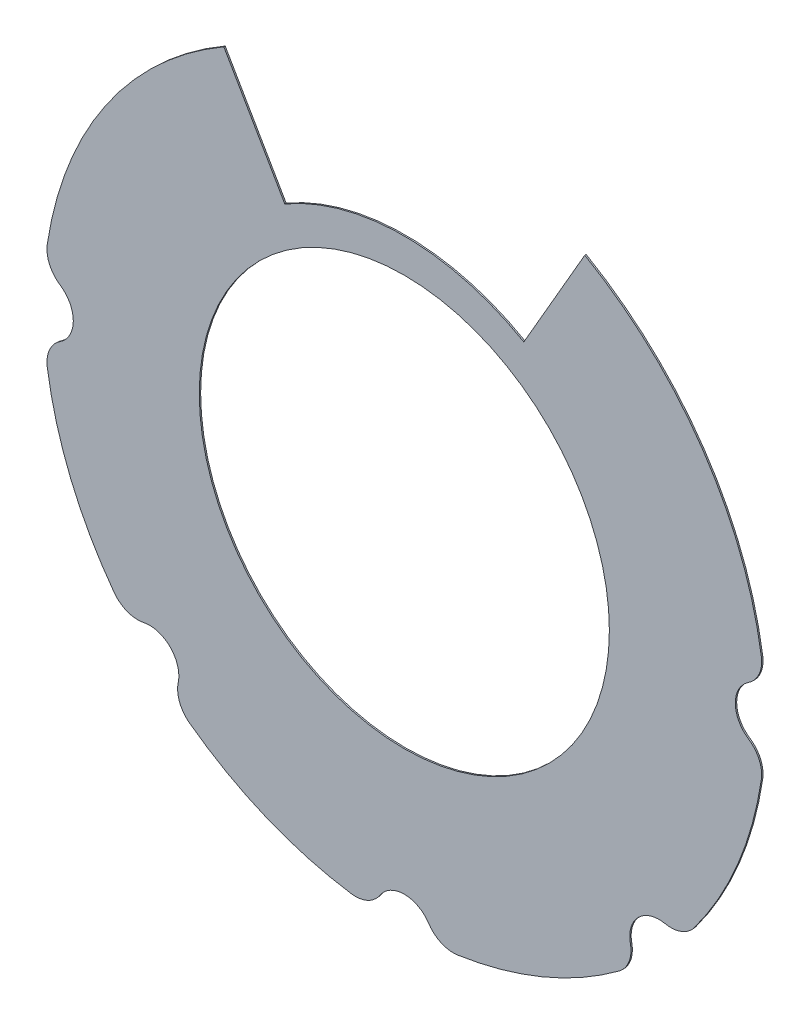
ISO-10303-21;
HEADER;
FILE_DESCRIPTION(('STEP AP214'),'2;1');
FILE_NAME('part.step','',(''),(''),'','','');
FILE_SCHEMA(('AUTOMOTIVE_DESIGN { 1 0 10303 214 1 1 1 1 }'));
ENDSEC;
DATA;
#1=APPLICATION_CONTEXT('core data for automotive mechanical design processes');
#2=APPLICATION_PROTOCOL_DEFINITION('international standard','automotive_design',2000,#1);
#3=PRODUCT_CONTEXT('',#1,'mechanical');
#4=PRODUCT('Part','Part','',(#3));
#5=PRODUCT_RELATED_PRODUCT_CATEGORY('part','',(#4));
#6=PRODUCT_DEFINITION_FORMATION('','',#4);
#7=PRODUCT_DEFINITION_CONTEXT('part definition',#1,'design');
#8=PRODUCT_DEFINITION('design','',#6,#7);
#9=PRODUCT_DEFINITION_SHAPE('','',#8);
#10=(LENGTH_UNIT() NAMED_UNIT(*) SI_UNIT(.MILLI.,.METRE.));
#11=(NAMED_UNIT(*) PLANE_ANGLE_UNIT() SI_UNIT($,.RADIAN.));
#12=(NAMED_UNIT(*) SI_UNIT($,.STERADIAN.) SOLID_ANGLE_UNIT());
#13=UNCERTAINTY_MEASURE_WITH_UNIT(LENGTH_MEASURE(1.E-05),#10,'distance_accuracy_value','');
#14=(GEOMETRIC_REPRESENTATION_CONTEXT(3) GLOBAL_UNCERTAINTY_ASSIGNED_CONTEXT((#13)) GLOBAL_UNIT_ASSIGNED_CONTEXT((#10,
#11,#12)) REPRESENTATION_CONTEXT('',''));
#15=CARTESIAN_POINT('',(0.,0.,0.));
#16=DIRECTION('',(0.,0.,1.));
#17=DIRECTION('',(1.,0.,0.));
#18=AXIS2_PLACEMENT_3D('',#15,#16,#17);
#19=CARTESIAN_POINT('',(-35.5513380281698,5.30522284233726,-15.0100000000009));
#20=DIRECTION('',(0.,0.,1.));
#21=DIRECTION('',(1.,0.,0.));
#22=AXIS2_PLACEMENT_3D('',#19,#20,#21);
#23=CYLINDRICAL_SURFACE('',#22,3.17999999998725);
#24=CARTESIAN_POINT('',(-35.5513380281698,5.30522284233726,-15.0100000000009));
#25=DIRECTION('',(0.,0.,1.));
#26=DIRECTION('',(1.,0.,0.));
#27=AXIS2_PLACEMENT_3D('',#24,#25,#26);
#28=CIRCLE('',#27,3.17999999998725);
#29=CARTESIAN_POINT('',(-38.6965113465558,5.77456791506877,-15.0100000000009));
#30=VERTEX_POINT('',#29);
#31=CARTESIAN_POINT('',(-37.3020453564706,2.65052439418642,-15.0100000000009));
#32=VERTEX_POINT('',#31);
#33=EDGE_CURVE('E20',#30,#32,#28,.T.);
#34=ORIENTED_EDGE('',*,*,#33,.T.);
#35=DIRECTION('',(0.,0.,-1.));
#36=VECTOR('',#35,1.);
#37=CARTESIAN_POINT('',(-37.3020453566199,2.65052439428489,-14.935));
#38=LINE('',#37,#36);
#39=CARTESIAN_POINT('',(-37.3020453564679,2.65052439419047,-14.859999999999));
#40=VERTEX_POINT('',#39);
#41=EDGE_CURVE('E157',#32,#40,#38,.F.);
#42=ORIENTED_EDGE('',*,*,#41,.T.);
#43=CARTESIAN_POINT('',(-35.5513380281698,5.30522284233726,-14.859999999999));
#44=DIRECTION('',(0.,0.,1.));
#45=DIRECTION('',(1.,0.,0.));
#46=AXIS2_PLACEMENT_3D('',#43,#44,#45);
#47=CIRCLE('',#46,3.17999999998725);
#48=CARTESIAN_POINT('',(-38.696511346566,5.77456791507029,-14.859999999999));
#49=VERTEX_POINT('',#48);
#50=EDGE_CURVE('E284',#40,#49,#47,.F.);
#51=ORIENTED_EDGE('',*,*,#50,.T.);
#52=DIRECTION('',(0.,0.,-1.));
#53=VECTOR('',#52,1.);
#54=CARTESIAN_POINT('',(-38.6965113465631,5.77456791509018,-14.935));
#55=LINE('',#54,#53);
#56=EDGE_CURVE('E166',#49,#30,#55,.T.);
#57=ORIENTED_EDGE('',*,*,#56,.T.);
#58=EDGE_LOOP('',(#34,#42,#51,#57));
#59=FACE_BOUND('',#58,.T.);
#60=ADVANCED_FACE('F16',(#59),#23,.T.);
#61=CARTESIAN_POINT('',(0.,0.,-15.0100000000009));
#62=DIRECTION('',(0.,0.,1.));
#63=DIRECTION('',(1.,0.,0.));
#64=AXIS2_PLACEMENT_3D('',#61,#62,#63);
#65=CYLINDRICAL_SURFACE('',#64,39.1250000000086);
#66=DIRECTION('',(0.,0.,1.));
#67=VECTOR('',#66,1.);
#68=CARTESIAN_POINT('',(-19.5624999999948,33.8832439230683,-14.935));
#69=LINE('',#68,#67);
#70=CARTESIAN_POINT('',(-19.5624999999971,33.8832439230723,-14.859999999999));
#71=VERTEX_POINT('',#70);
#72=CARTESIAN_POINT('',(-19.5624999999971,33.8832439230723,-15.0100000000009));
#73=VERTEX_POINT('',#72);
#74=EDGE_CURVE('E214',#71,#73,#69,.F.);
#75=ORIENTED_EDGE('',*,*,#74,.T.);
#76=CARTESIAN_POINT('',(0.,0.,-15.0100000000009));
#77=DIRECTION('',(0.,0.,1.));
#78=DIRECTION('',(1.,0.,0.));
#79=AXIS2_PLACEMENT_3D('',#76,#77,#78);
#80=CIRCLE('',#79,39.1250000000086);
#81=EDGE_CURVE('E289',#73,#30,#80,.T.);
#82=ORIENTED_EDGE('',*,*,#81,.T.);
#83=ORIENTED_EDGE('',*,*,#56,.F.);
#84=CARTESIAN_POINT('',(0.,0.,-14.859999999999));
#85=DIRECTION('',(0.,0.,1.));
#86=DIRECTION('',(1.,0.,0.));
#87=AXIS2_PLACEMENT_3D('',#84,#85,#86);
#88=CIRCLE('',#87,39.1250000000086);
#89=EDGE_CURVE('E281',#49,#71,#88,.F.);
#90=ORIENTED_EDGE('',*,*,#89,.T.);
#91=EDGE_LOOP('',(#75,#82,#83,#90));
#92=FACE_BOUND('',#91,.T.);
#93=ADVANCED_FACE('F489',(#92),#65,.T.);
#94=CARTESIAN_POINT('',(-12.8228499999942,22.2098276978301,-15.0130000000004));
#95=DIRECTION('',(0.866025403784543,0.499999999999819,0.));
#96=DIRECTION('',(-0.499999999999819,0.866025403784543,0.));
#97=AXIS2_PLACEMENT_3D('',#94,#95,#96);
#98=PLANE('',#97);
#99=DIRECTION('',(-0.499999999999819,0.866025403784543,0.));
#100=VECTOR('',#99,1.);
#101=CARTESIAN_POINT('',(-12.8228499999942,22.2098276978301,-14.859999999999));
#102=LINE('',#101,#100);
#103=CARTESIAN_POINT('',(-12.9549999999936,22.4387182120444,-14.859999999999));
#104=VERTEX_POINT('',#103);
#105=EDGE_CURVE('E278',#71,#104,#102,.F.);
#106=ORIENTED_EDGE('',*,*,#105,.T.);
#107=DIRECTION('',(0.,0.,-1.));
#108=VECTOR('',#107,1.);
#109=CARTESIAN_POINT('',(-12.9549999999957,22.4387182120432,-14.935));
#110=LINE('',#109,#108);
#111=CARTESIAN_POINT('',(-12.9549999999936,22.4387182120444,-15.0100000000009));
#112=VERTEX_POINT('',#111);
#113=EDGE_CURVE('E212',#104,#112,#110,.T.);
#114=ORIENTED_EDGE('',*,*,#113,.T.);
#115=DIRECTION('',(-0.499999999999819,0.866025403784543,0.));
#116=VECTOR('',#115,1.);
#117=CARTESIAN_POINT('',(-12.8228499999942,22.2098276978301,-15.0100000000009));
#118=LINE('',#117,#116);
#119=EDGE_CURVE('E291',#112,#73,#118,.T.);
#120=ORIENTED_EDGE('',*,*,#119,.T.);
#121=ORIENTED_EDGE('',*,*,#74,.F.);
#122=EDGE_LOOP('',(#106,#114,#120,#121));
#123=FACE_BOUND('',#122,.T.);
#124=ADVANCED_FACE('F487',(#123),#98,.T.);
#125=CARTESIAN_POINT('',(0.,0.,-14.859999999999));
#126=DIRECTION('',(0.,0.,-1.));
#127=DIRECTION('',(0.,1.,0.));
#128=AXIS2_PLACEMENT_3D('',#125,#126,#127);
#129=CYLINDRICAL_SURFACE('',#128,25.9099999999878);
#130=CARTESIAN_POINT('',(0.,0.,-14.859999999999));
#131=DIRECTION('',(0.,0.,-1.));
#132=DIRECTION('',(0.,1.,0.));
#133=AXIS2_PLACEMENT_3D('',#130,#131,#132);
#134=CIRCLE('',#133,25.9099999999878);
#135=CARTESIAN_POINT('',(12.954999999992,22.4387182120467,-14.859999999999));
#136=VERTEX_POINT('',#135);
#137=EDGE_CURVE('E275',#104,#136,#134,.T.);
#138=ORIENTED_EDGE('',*,*,#137,.T.);
#139=DIRECTION('',(0.,0.,-1.));
#140=VECTOR('',#139,1.);
#141=CARTESIAN_POINT('',(12.9549999999927,22.4387182120478,-14.935));
#142=LINE('',#141,#140);
#143=CARTESIAN_POINT('',(12.954999999992,22.4387182120467,-15.0100000000009));
#144=VERTEX_POINT('',#143);
#145=EDGE_CURVE('E210',#136,#144,#142,.T.);
#146=ORIENTED_EDGE('',*,*,#145,.T.);
#147=CARTESIAN_POINT('',(0.,0.,-15.0100000000009));
#148=DIRECTION('',(0.,0.,-1.));
#149=DIRECTION('',(0.,1.,0.));
#150=AXIS2_PLACEMENT_3D('',#147,#148,#149);
#151=CIRCLE('',#150,25.9099999999878);
#152=EDGE_CURVE('E294',#144,#112,#151,.F.);
#153=ORIENTED_EDGE('',*,*,#152,.T.);
#154=ORIENTED_EDGE('',*,*,#113,.F.);
#155=EDGE_LOOP('',(#138,#146,#153,#154));
#156=FACE_BOUND('',#155,.T.);
#157=ADVANCED_FACE('F484',(#156),#129,.T.);
#158=CARTESIAN_POINT('',(19.6946499999938,34.1121344372914,-14.8569999999995));
#159=DIRECTION('',(0.866025403784623,-0.49999999999968,0.));
#160=DIRECTION('',(-0.49999999999968,-0.866025403784623,0.));
#161=AXIS2_PLACEMENT_3D('',#158,#159,#160);
#162=PLANE('',#161);
#163=DIRECTION('',(-0.49999999999968,-0.866025403784623,0.));
#164=VECTOR('',#163,1.);
#165=CARTESIAN_POINT('',(19.6946499999938,34.1121344372914,-14.859999999999));
#166=LINE('',#165,#164);
#167=CARTESIAN_POINT('',(19.562500000002,33.8832439230749,-14.859999999999));
#168=VERTEX_POINT('',#167);
#169=EDGE_CURVE('E272',#136,#168,#166,.F.);
#170=ORIENTED_EDGE('',*,*,#169,.T.);
#171=DIRECTION('',(0.,0.,-1.));
#172=VECTOR('',#171,1.);
#173=CARTESIAN_POINT('',(19.5625000000065,33.8832439230724,-14.935));
#174=LINE('',#173,#172);
#175=CARTESIAN_POINT('',(19.562500000002,33.8832439230749,-15.0100000000009));
#176=VERTEX_POINT('',#175);
#177=EDGE_CURVE('E208',#168,#176,#174,.T.);
#178=ORIENTED_EDGE('',*,*,#177,.T.);
#179=DIRECTION('',(-0.49999999999968,-0.866025403784623,0.));
#180=VECTOR('',#179,1.);
#181=CARTESIAN_POINT('',(19.6946499999938,34.1121344372914,-15.0100000000009));
#182=LINE('',#181,#180);
#183=EDGE_CURVE('E297',#176,#144,#182,.T.);
#184=ORIENTED_EDGE('',*,*,#183,.T.);
#185=ORIENTED_EDGE('',*,*,#145,.F.);
#186=EDGE_LOOP('',(#170,#178,#184,#185));
#187=FACE_BOUND('',#186,.T.);
#188=ADVANCED_FACE('F482',(#187),#162,.F.);
#189=CARTESIAN_POINT('',(0.,0.,-15.0100000000009));
#190=DIRECTION('',(0.,0.,1.));
#191=DIRECTION('',(1.,0.,0.));
#192=AXIS2_PLACEMENT_3D('',#189,#190,#191);
#193=CYLINDRICAL_SURFACE('',#192,39.1250000000086);
#194=ORIENTED_EDGE('',*,*,#177,.F.);
#195=CARTESIAN_POINT('',(0.,0.,-14.859999999999));
#196=DIRECTION('',(0.,0.,1.));
#197=DIRECTION('',(1.,0.,0.));
#198=AXIS2_PLACEMENT_3D('',#195,#196,#197);
#199=CIRCLE('',#198,39.1250000000086);
#200=CARTESIAN_POINT('',(38.6965113465484,5.77456791504861,-14.859999999999));
#201=VERTEX_POINT('',#200);
#202=EDGE_CURVE('E269',#168,#201,#199,.F.);
#203=ORIENTED_EDGE('',*,*,#202,.T.);
#204=DIRECTION('',(0.,0.,-1.));
#205=VECTOR('',#204,1.);
#206=CARTESIAN_POINT('',(38.6965113465482,5.77456791504986,-14.935));
#207=LINE('',#206,#205);
#208=CARTESIAN_POINT('',(38.6965113465586,5.77456791505013,-15.0100000000009));
#209=VERTEX_POINT('',#208);
#210=EDGE_CURVE('E206',#201,#209,#207,.T.);
#211=ORIENTED_EDGE('',*,*,#210,.T.);
#212=CARTESIAN_POINT('',(0.,0.,-15.0100000000009));
#213=DIRECTION('',(0.,0.,1.));
#214=DIRECTION('',(1.,0.,0.));
#215=AXIS2_PLACEMENT_3D('',#212,#213,#214);
#216=CIRCLE('',#215,39.1250000000086);
#217=EDGE_CURVE('E300',#209,#176,#216,.T.);
#218=ORIENTED_EDGE('',*,*,#217,.T.);
#219=EDGE_LOOP('',(#194,#203,#211,#218));
#220=FACE_BOUND('',#219,.T.);
#221=ADVANCED_FACE('F478',(#220),#193,.T.);
#222=CARTESIAN_POINT('',(35.5513380281698,5.30522284233726,-14.859999999999));
#223=DIRECTION('',(0.,0.,-1.));
#224=DIRECTION('',(0.,1.,0.));
#225=AXIS2_PLACEMENT_3D('',#222,#223,#224);
#226=CYLINDRICAL_SURFACE('',#225,3.17999999998725);
#227=CARTESIAN_POINT('',(35.5513380281698,5.30522284233726,-14.859999999999));
#228=DIRECTION('',(0.,0.,-1.));
#229=DIRECTION('',(0.,1.,0.));
#230=AXIS2_PLACEMENT_3D('',#227,#228,#229);
#231=CIRCLE('',#230,3.17999999998725);
#232=CARTESIAN_POINT('',(37.3020453564583,2.65052439417827,-14.859999999999));
#233=VERTEX_POINT('',#232);
#234=EDGE_CURVE('E266',#201,#233,#231,.T.);
#235=ORIENTED_EDGE('',*,*,#234,.T.);
#236=DIRECTION('',(0.,0.,1.));
#237=VECTOR('',#236,1.);
#238=CARTESIAN_POINT('',(37.3020453565952,2.6505243942686,-14.935));
#239=LINE('',#238,#237);
#240=CARTESIAN_POINT('',(37.3020453564556,2.65052439418232,-15.0100000000009));
#241=VERTEX_POINT('',#240);
#242=EDGE_CURVE('E204',#233,#241,#239,.F.);
#243=ORIENTED_EDGE('',*,*,#242,.T.);
#244=CARTESIAN_POINT('',(35.5513380281698,5.30522284233726,-15.0100000000009));
#245=DIRECTION('',(0.,0.,-1.));
#246=DIRECTION('',(0.,1.,0.));
#247=AXIS2_PLACEMENT_3D('',#244,#245,#246);
#248=CIRCLE('',#247,3.17999999998725);
#249=EDGE_CURVE('E303',#241,#209,#248,.F.);
#250=ORIENTED_EDGE('',*,*,#249,.T.);
#251=ORIENTED_EDGE('',*,*,#210,.F.);
#252=EDGE_LOOP('',(#235,#243,#250,#251));
#253=FACE_BOUND('',#252,.T.);
#254=ADVANCED_FACE('F474',(#253),#226,.T.);
#255=CARTESIAN_POINT('',(39.0499999999962,0.,-14.859999999999));
#256=DIRECTION('',(0.,0.,-1.));
#257=DIRECTION('',(0.,1.,0.));
#258=AXIS2_PLACEMENT_3D('',#255,#256,#257);
#259=CYLINDRICAL_SURFACE('',#258,3.175);
#260=CARTESIAN_POINT('',(39.0499999999962,0.,-15.0100000000009));
#261=DIRECTION('',(0.,0.,-1.));
#262=DIRECTION('',(0.,1.,0.));
#263=AXIS2_PLACEMENT_3D('',#260,#261,#262);
#264=CIRCLE('',#263,3.175);
#265=CARTESIAN_POINT('',(37.3020453564532,-2.65052439418078,-15.0100000000009));
#266=VERTEX_POINT('',#265);
#267=EDGE_CURVE('E306',#266,#241,#264,.T.);
#268=ORIENTED_EDGE('',*,*,#267,.T.);
#269=ORIENTED_EDGE('',*,*,#242,.F.);
#270=CARTESIAN_POINT('',(39.0499999999962,0.,-14.859999999999));
#271=DIRECTION('',(0.,0.,-1.));
#272=DIRECTION('',(0.,1.,0.));
#273=AXIS2_PLACEMENT_3D('',#270,#271,#272);
#274=CIRCLE('',#273,3.175);
#275=CARTESIAN_POINT('',(37.3020453564506,-2.65052439418483,-14.859999999999));
#276=VERTEX_POINT('',#275);
#277=EDGE_CURVE('E263',#233,#276,#274,.F.);
#278=ORIENTED_EDGE('',*,*,#277,.T.);
#279=DIRECTION('',(0.,0.,-1.));
#280=VECTOR('',#279,1.);
#281=CARTESIAN_POINT('',(37.3020453565852,-2.65052439427361,-14.935));
#282=LINE('',#281,#280);
#283=EDGE_CURVE('E200',#276,#266,#282,.T.);
#284=ORIENTED_EDGE('',*,*,#283,.T.);
#285=EDGE_LOOP('',(#268,#269,#278,#284));
#286=FACE_BOUND('',#285,.T.);
#287=ADVANCED_FACE('F470',(#286),#259,.F.);
#288=CARTESIAN_POINT('',(35.5513380281698,-5.30522284233726,-15.0100000000009));
#289=DIRECTION('',(0.,0.,1.));
#290=DIRECTION('',(1.,0.,0.));
#291=AXIS2_PLACEMENT_3D('',#288,#289,#290);
#292=CYLINDRICAL_SURFACE('',#291,3.17999999998725);
#293=CARTESIAN_POINT('',(35.5513380281698,-5.30522284233726,-15.0100000000009));
#294=DIRECTION('',(0.,0.,1.));
#295=DIRECTION('',(1.,0.,0.));
#296=AXIS2_PLACEMENT_3D('',#293,#294,#295);
#297=CIRCLE('',#296,3.17999999998725);
#298=CARTESIAN_POINT('',(38.6965113465556,-5.77456791507001,-15.0100000000009));
#299=VERTEX_POINT('',#298);
#300=EDGE_CURVE('E309',#299,#266,#297,.T.);
#301=ORIENTED_EDGE('',*,*,#300,.T.);
#302=ORIENTED_EDGE('',*,*,#283,.F.);
#303=CARTESIAN_POINT('',(35.5513380281698,-5.30522284233726,-14.859999999999));
#304=DIRECTION('',(0.,0.,1.));
#305=DIRECTION('',(1.,0.,0.));
#306=AXIS2_PLACEMENT_3D('',#303,#304,#305);
#307=CIRCLE('',#306,3.17999999998725);
#308=CARTESIAN_POINT('',(38.6965113465658,-5.77456791507154,-14.859999999999));
#309=VERTEX_POINT('',#308);
#310=EDGE_CURVE('E260',#276,#309,#307,.F.);
#311=ORIENTED_EDGE('',*,*,#310,.T.);
#312=DIRECTION('',(0.,0.,-1.));
#313=VECTOR('',#312,1.);
#314=CARTESIAN_POINT('',(38.6965113465627,-5.77456791509266,-14.935));
#315=LINE('',#314,#313);
#316=EDGE_CURVE('E198',#309,#299,#315,.T.);
#317=ORIENTED_EDGE('',*,*,#316,.T.);
#318=EDGE_LOOP('',(#301,#302,#311,#317));
#319=FACE_BOUND('',#318,.T.);
#320=ADVANCED_FACE('F466',(#319),#292,.T.);
#321=CARTESIAN_POINT('',(0.,0.,-15.0100000000009));
#322=DIRECTION('',(0.,0.,1.));
#323=DIRECTION('',(1.,0.,0.));
#324=AXIS2_PLACEMENT_3D('',#321,#322,#323);
#325=CYLINDRICAL_SURFACE('',#324,39.1250000000086);
#326=ORIENTED_EDGE('',*,*,#316,.F.);
#327=CARTESIAN_POINT('',(0.,0.,-14.859999999999));
#328=DIRECTION('',(0.,0.,1.));
#329=DIRECTION('',(1.,0.,0.));
#330=AXIS2_PLACEMENT_3D('',#327,#328,#329);
#331=CIRCLE('',#330,39.1250000000086);
#332=CARTESIAN_POINT('',(31.4458017125821,-23.2793294502578,-14.859999999999));
#333=VERTEX_POINT('',#332);
#334=EDGE_CURVE('E258',#309,#333,#331,.F.);
#335=ORIENTED_EDGE('',*,*,#334,.T.);
#336=DIRECTION('',(0.,0.,1.));
#337=VECTOR('',#336,1.);
#338=CARTESIAN_POINT('',(31.4458017125908,-23.2793294502462,-14.935));
#339=LINE('',#338,#337);
#340=CARTESIAN_POINT('',(31.4458017125821,-23.2793294502578,-15.0100000000009));
#341=VERTEX_POINT('',#340);
#342=EDGE_CURVE('E35',#341,#333,#339,.T.);
#343=ORIENTED_EDGE('',*,*,#342,.F.);
#344=CARTESIAN_POINT('',(0.,0.,-15.0100000000009));
#345=DIRECTION('',(0.,0.,1.));
#346=DIRECTION('',(1.,0.,0.));
#347=AXIS2_PLACEMENT_3D('',#344,#345,#346);
#348=CIRCLE('',#347,39.1250000000086);
#349=EDGE_CURVE('E312',#341,#299,#348,.T.);
#350=ORIENTED_EDGE('',*,*,#349,.T.);
#351=EDGE_LOOP('',(#326,#335,#343,#350));
#352=FACE_BOUND('',#351,.T.);
#353=ADVANCED_FACE('F463',(#352),#325,.T.);
#354=CARTESIAN_POINT('',(27.61251980533,-27.61251980533,-14.859999999999));
#355=DIRECTION('',(0.,0.,-1.));
#356=DIRECTION('',(0.,1.,0.));
#357=AXIS2_PLACEMENT_3D('',#354,#355,#356);
#358=CYLINDRICAL_SURFACE('',#357,3.17499999999215);
#359=CARTESIAN_POINT('',(27.61251980533,-27.61251980533,-15.0100000000009));
#360=DIRECTION('',(0.,0.,-1.));
#361=DIRECTION('',(0.,1.,0.));
#362=AXIS2_PLACEMENT_3D('',#359,#360,#361);
#363=CIRCLE('',#362,3.17499999999215);
#364=CARTESIAN_POINT('',(24.5023254508345,-28.2507329963752,-15.0100000000009));
#365=VERTEX_POINT('',#364);
#366=CARTESIAN_POINT('',(28.2507329963749,-24.502325450836,-15.0100000000009));
#367=VERTEX_POINT('',#366);
#368=EDGE_CURVE('E315',#365,#367,#363,.T.);
#369=ORIENTED_EDGE('',*,*,#368,.T.);
#370=DIRECTION('',(0.,0.,1.));
#371=VECTOR('',#370,1.);
#372=CARTESIAN_POINT('',(28.2507329964124,-24.5023254508437,-14.935));
#373=LINE('',#372,#371);
#374=CARTESIAN_POINT('',(28.2507329963749,-24.502325450836,-14.859999999999));
#375=VERTEX_POINT('',#374);
#376=EDGE_CURVE('E196',#375,#367,#373,.F.);
#377=ORIENTED_EDGE('',*,*,#376,.F.);
#378=CARTESIAN_POINT('',(27.61251980533,-27.61251980533,-14.859999999999));
#379=DIRECTION('',(0.,0.,-1.));
#380=DIRECTION('',(0.,1.,0.));
#381=AXIS2_PLACEMENT_3D('',#378,#379,#380);
#382=CIRCLE('',#381,3.17499999999215);
#383=CARTESIAN_POINT('',(24.502325450833,-28.2507329963755,-14.859999999999));
#384=VERTEX_POINT('',#383);
#385=EDGE_CURVE('E255',#375,#384,#382,.F.);
#386=ORIENTED_EDGE('',*,*,#385,.T.);
#387=DIRECTION('',(0.,0.,-1.));
#388=VECTOR('',#387,1.);
#389=CARTESIAN_POINT('',(24.5023254508407,-28.250732996413,-14.935));
#390=LINE('',#389,#388);
#391=EDGE_CURVE('E193',#384,#365,#390,.T.);
#392=ORIENTED_EDGE('',*,*,#391,.T.);
#393=EDGE_LOOP('',(#369,#377,#386,#392));
#394=FACE_BOUND('',#393,.T.);
#395=ADVANCED_FACE('F422',(#394),#358,.F.);
#396=CARTESIAN_POINT('',(21.3872331524509,-28.8899512474902,-15.0100000000009));
#397=DIRECTION('',(0.,0.,1.));
#398=DIRECTION('',(1.,0.,0.));
#399=AXIS2_PLACEMENT_3D('',#396,#397,#398);
#400=CYLINDRICAL_SURFACE('',#399,3.17999999999959);
#401=CARTESIAN_POINT('',(21.3872331524509,-28.8899512474902,-15.0100000000009));
#402=DIRECTION('',(0.,0.,1.));
#403=DIRECTION('',(1.,0.,0.));
#404=AXIS2_PLACEMENT_3D('',#401,#402,#403);
#405=CIRCLE('',#404,3.17999999999959);
#406=CARTESIAN_POINT('',(23.2793294502537,-31.4458017125766,-15.0100000000009));
#407=VERTEX_POINT('',#406);
#408=EDGE_CURVE('E318',#407,#365,#405,.T.);
#409=ORIENTED_EDGE('',*,*,#408,.T.);
#410=ORIENTED_EDGE('',*,*,#391,.F.);
#411=CARTESIAN_POINT('',(21.3872331524509,-28.8899512474902,-14.859999999999));
#412=DIRECTION('',(0.,0.,1.));
#413=DIRECTION('',(1.,0.,0.));
#414=AXIS2_PLACEMENT_3D('',#411,#412,#413);
#415=CIRCLE('',#414,3.17999999999959);
#416=CARTESIAN_POINT('',(23.2793294502578,-31.4458017125821,-14.859999999999));
#417=VERTEX_POINT('',#416);
#418=EDGE_CURVE('E252',#384,#417,#415,.F.);
#419=ORIENTED_EDGE('',*,*,#418,.T.);
#420=DIRECTION('',(0.,0.,-1.));
#421=VECTOR('',#420,1.);
#422=CARTESIAN_POINT('',(23.2793294502461,-31.4458017125908,-14.935));
#423=LINE('',#422,#421);
#424=EDGE_CURVE('E191',#417,#407,#423,.T.);
#425=ORIENTED_EDGE('',*,*,#424,.T.);
#426=EDGE_LOOP('',(#409,#410,#419,#425));
#427=FACE_BOUND('',#426,.T.);
#428=ADVANCED_FACE('F417',(#427),#400,.T.);
#429=CARTESIAN_POINT('',(0.,0.,-15.0100000000009));
#430=DIRECTION('',(0.,0.,1.));
#431=DIRECTION('',(1.,0.,0.));
#432=AXIS2_PLACEMENT_3D('',#429,#430,#431);
#433=CYLINDRICAL_SURFACE('',#432,39.1250000000086);
#434=ORIENTED_EDGE('',*,*,#424,.F.);
#435=CARTESIAN_POINT('',(0.,0.,-14.859999999999));
#436=DIRECTION('',(0.,0.,1.));
#437=DIRECTION('',(1.,0.,0.));
#438=AXIS2_PLACEMENT_3D('',#435,#436,#437);
#439=CIRCLE('',#438,39.1250000000086);
#440=CARTESIAN_POINT('',(5.77456791504861,-38.6965113465484,-14.859999999999));
#441=VERTEX_POINT('',#440);
#442=EDGE_CURVE('E249',#417,#441,#439,.F.);
#443=ORIENTED_EDGE('',*,*,#442,.T.);
#444=DIRECTION('',(0.,0.,-1.));
#445=VECTOR('',#444,1.);
#446=CARTESIAN_POINT('',(5.77456791504986,-38.6965113465482,-14.935));
#447=LINE('',#446,#445);
#448=CARTESIAN_POINT('',(5.77456791505013,-38.6965113465586,-15.0100000000009));
#449=VERTEX_POINT('',#448);
#450=EDGE_CURVE('E189',#441,#449,#447,.T.);
#451=ORIENTED_EDGE('',*,*,#450,.T.);
#452=CARTESIAN_POINT('',(0.,0.,-15.0100000000009));
#453=DIRECTION('',(0.,0.,1.));
#454=DIRECTION('',(1.,0.,0.));
#455=AXIS2_PLACEMENT_3D('',#452,#453,#454);
#456=CIRCLE('',#455,39.1250000000086);
#457=EDGE_CURVE('E321',#449,#407,#456,.T.);
#458=ORIENTED_EDGE('',*,*,#457,.T.);
#459=EDGE_LOOP('',(#434,#443,#451,#458));
#460=FACE_BOUND('',#459,.T.);
#461=ADVANCED_FACE('F412',(#460),#433,.T.);
#462=CARTESIAN_POINT('',(5.30522284233726,-35.5513380281698,-14.859999999999));
#463=DIRECTION('',(0.,0.,-1.));
#464=DIRECTION('',(-1.,0.,0.));
#465=AXIS2_PLACEMENT_3D('',#462,#463,#464);
#466=CYLINDRICAL_SURFACE('',#465,3.17999999998725);
#467=CARTESIAN_POINT('',(5.30522284233726,-35.5513380281698,-14.859999999999));
#468=DIRECTION('',(0.,0.,-1.));
#469=DIRECTION('',(-1.,0.,0.));
#470=AXIS2_PLACEMENT_3D('',#467,#468,#469);
#471=CIRCLE('',#470,3.17999999998725);
#472=CARTESIAN_POINT('',(2.65052439417865,-37.3020453564588,-14.859999999999));
#473=VERTEX_POINT('',#472);
#474=EDGE_CURVE('E246',#441,#473,#471,.T.);
#475=ORIENTED_EDGE('',*,*,#474,.T.);
#476=DIRECTION('',(0.,0.,1.));
#477=VECTOR('',#476,1.);
#478=CARTESIAN_POINT('',(2.65052439426937,-37.3020453565964,-14.935));
#479=LINE('',#478,#477);
#480=CARTESIAN_POINT('',(2.6505243941827,-37.3020453564562,-15.0100000000009));
#481=VERTEX_POINT('',#480);
#482=EDGE_CURVE('E187',#473,#481,#479,.F.);
#483=ORIENTED_EDGE('',*,*,#482,.T.);
#484=CARTESIAN_POINT('',(5.30522284233726,-35.5513380281698,-15.0100000000009));
#485=DIRECTION('',(0.,0.,-1.));
#486=DIRECTION('',(-1.,0.,0.));
#487=AXIS2_PLACEMENT_3D('',#484,#485,#486);
#488=CIRCLE('',#487,3.17999999998725);
#489=EDGE_CURVE('E324',#481,#449,#488,.F.);
#490=ORIENTED_EDGE('',*,*,#489,.T.);
#491=ORIENTED_EDGE('',*,*,#450,.F.);
#492=EDGE_LOOP('',(#475,#483,#490,#491));
#493=FACE_BOUND('',#492,.T.);
#494=ADVANCED_FACE('F405',(#493),#466,.T.);
#495=CARTESIAN_POINT('',(0.,-39.0499999999962,-14.859999999999));
#496=DIRECTION('',(0.,0.,-1.));
#497=DIRECTION('',(-1.,0.,0.));
#498=AXIS2_PLACEMENT_3D('',#495,#496,#497);
#499=CYLINDRICAL_SURFACE('',#498,3.175);
#500=CARTESIAN_POINT('',(0.,-39.0499999999962,-15.0100000000009));
#501=DIRECTION('',(0.,0.,-1.));
#502=DIRECTION('',(-1.,0.,0.));
#503=AXIS2_PLACEMENT_3D('',#500,#501,#502);
#504=CIRCLE('',#503,3.175);
#505=CARTESIAN_POINT('',(-2.65052439418039,-37.3020453564527,-15.0100000000009));
#506=VERTEX_POINT('',#505);
#507=EDGE_CURVE('E327',#506,#481,#504,.T.);
#508=ORIENTED_EDGE('',*,*,#507,.T.);
#509=ORIENTED_EDGE('',*,*,#482,.F.);
#510=CARTESIAN_POINT('',(0.,-39.0499999999962,-14.859999999999));
#511=DIRECTION('',(0.,0.,-1.));
#512=DIRECTION('',(-1.,0.,0.));
#513=AXIS2_PLACEMENT_3D('',#510,#511,#512);
#514=CIRCLE('',#513,3.175);
#515=CARTESIAN_POINT('',(-2.65052439418444,-37.30204535645,-14.859999999999));
#516=VERTEX_POINT('',#515);
#517=EDGE_CURVE('E243',#473,#516,#514,.F.);
#518=ORIENTED_EDGE('',*,*,#517,.T.);
#519=DIRECTION('',(0.,0.,-1.));
#520=VECTOR('',#519,1.);
#521=CARTESIAN_POINT('',(-2.65052439427284,-37.302045356584,-14.935));
#522=LINE('',#521,#520);
#523=EDGE_CURVE('E184',#516,#506,#522,.T.);
#524=ORIENTED_EDGE('',*,*,#523,.T.);
#525=EDGE_LOOP('',(#508,#509,#518,#524));
#526=FACE_BOUND('',#525,.T.);
#527=ADVANCED_FACE('F400',(#526),#499,.F.);
#528=CARTESIAN_POINT('',(-5.30522284233726,-35.5513380281698,-15.0100000000009));
#529=DIRECTION('',(0.,0.,1.));
#530=DIRECTION('',(1.,0.,0.));
#531=AXIS2_PLACEMENT_3D('',#528,#529,#530);
#532=CYLINDRICAL_SURFACE('',#531,3.17999999998725);
#533=CARTESIAN_POINT('',(-5.30522284233726,-35.5513380281698,-15.0100000000009));
#534=DIRECTION('',(0.,0.,1.));
#535=DIRECTION('',(1.,0.,0.));
#536=AXIS2_PLACEMENT_3D('',#533,#534,#535);
#537=CIRCLE('',#536,3.17999999998725);
#538=CARTESIAN_POINT('',(-5.77456791506877,-38.6965113465558,-15.0100000000009));
#539=VERTEX_POINT('',#538);
#540=EDGE_CURVE('E330',#539,#506,#537,.T.);
#541=ORIENTED_EDGE('',*,*,#540,.T.);
#542=ORIENTED_EDGE('',*,*,#523,.F.);
#543=CARTESIAN_POINT('',(-5.30522284233726,-35.5513380281698,-14.859999999999));
#544=DIRECTION('',(0.,0.,1.));
#545=DIRECTION('',(1.,0.,0.));
#546=AXIS2_PLACEMENT_3D('',#543,#544,#545);
#547=CIRCLE('',#546,3.17999999998725);
#548=CARTESIAN_POINT('',(-5.7745679150703,-38.696511346566,-14.859999999999));
#549=VERTEX_POINT('',#548);
#550=EDGE_CURVE('E240',#516,#549,#547,.F.);
#551=ORIENTED_EDGE('',*,*,#550,.T.);
#552=DIRECTION('',(0.,0.,-1.));
#553=VECTOR('',#552,1.);
#554=CARTESIAN_POINT('',(-5.77456791509019,-38.6965113465631,-14.935));
#555=LINE('',#554,#553);
#556=EDGE_CURVE('E182',#549,#539,#555,.T.);
#557=ORIENTED_EDGE('',*,*,#556,.T.);
#558=EDGE_LOOP('',(#541,#542,#551,#557));
#559=FACE_BOUND('',#558,.T.);
#560=ADVANCED_FACE('F390',(#559),#532,.T.);
#561=CARTESIAN_POINT('',(0.,0.,-15.0100000000009));
#562=DIRECTION('',(0.,0.,1.));
#563=DIRECTION('',(1.,0.,0.));
#564=AXIS2_PLACEMENT_3D('',#561,#562,#563);
#565=CYLINDRICAL_SURFACE('',#564,39.1250000000086);
#566=ORIENTED_EDGE('',*,*,#556,.F.);
#567=CARTESIAN_POINT('',(0.,0.,-14.859999999999));
#568=DIRECTION('',(0.,0.,1.));
#569=DIRECTION('',(1.,0.,0.));
#570=AXIS2_PLACEMENT_3D('',#567,#568,#569);
#571=CIRCLE('',#570,39.1250000000086);
#572=CARTESIAN_POINT('',(-23.2793294502606,-31.4458017125629,-14.859999999999));
#573=VERTEX_POINT('',#572);
#574=EDGE_CURVE('E237',#549,#573,#571,.F.);
#575=ORIENTED_EDGE('',*,*,#574,.T.);
#576=DIRECTION('',(0.,0.,-1.));
#577=VECTOR('',#576,1.);
#578=CARTESIAN_POINT('',(-23.2793294502599,-31.4458017125634,-14.935));
#579=LINE('',#578,#577);
#580=CARTESIAN_POINT('',(-23.2793294502647,-31.4458017125684,-15.0100000000009));
#581=VERTEX_POINT('',#580);
#582=EDGE_CURVE('E180',#573,#581,#579,.T.);
#583=ORIENTED_EDGE('',*,*,#582,.T.);
#584=CARTESIAN_POINT('',(0.,0.,-15.0100000000009));
#585=DIRECTION('',(0.,0.,1.));
#586=DIRECTION('',(1.,0.,0.));
#587=AXIS2_PLACEMENT_3D('',#584,#585,#586);
#588=CIRCLE('',#587,39.1250000000086);
#589=EDGE_CURVE('E333',#581,#539,#588,.T.);
#590=ORIENTED_EDGE('',*,*,#589,.T.);
#591=EDGE_LOOP('',(#566,#575,#583,#590));
#592=FACE_BOUND('',#591,.T.);
#593=ADVANCED_FACE('F385',(#592),#565,.T.);
#594=CARTESIAN_POINT('',(-21.3872331524509,-28.8899512474902,-14.859999999999));
#595=DIRECTION('',(0.,0.,-1.));
#596=DIRECTION('',(-1.,0.,0.));
#597=AXIS2_PLACEMENT_3D('',#594,#595,#596);
#598=CYLINDRICAL_SURFACE('',#597,3.17999999999959);
#599=CARTESIAN_POINT('',(-21.3872331524509,-28.8899512474902,-14.859999999999));
#600=DIRECTION('',(0.,0.,-1.));
#601=DIRECTION('',(-1.,0.,0.));
#602=AXIS2_PLACEMENT_3D('',#599,#600,#601);
#603=CIRCLE('',#602,3.17999999999959);
#604=CARTESIAN_POINT('',(-24.502325450836,-28.2507329963749,-14.859999999999));
#605=VERTEX_POINT('',#604);
#606=EDGE_CURVE('E234',#573,#605,#603,.T.);
#607=ORIENTED_EDGE('',*,*,#606,.T.);
#608=DIRECTION('',(0.,0.,1.));
#609=VECTOR('',#608,1.);
#610=CARTESIAN_POINT('',(-24.5023254508437,-28.2507329964124,-14.935));
#611=LINE('',#610,#609);
#612=CARTESIAN_POINT('',(-24.5023254508345,-28.2507329963752,-15.0100000000009));
#613=VERTEX_POINT('',#612);
#614=EDGE_CURVE('E178',#605,#613,#611,.F.);
#615=ORIENTED_EDGE('',*,*,#614,.T.);
#616=CARTESIAN_POINT('',(-21.3872331524509,-28.8899512474902,-15.0100000000009));
#617=DIRECTION('',(0.,0.,-1.));
#618=DIRECTION('',(-1.,0.,0.));
#619=AXIS2_PLACEMENT_3D('',#616,#617,#618);
#620=CIRCLE('',#619,3.17999999999959);
#621=EDGE_CURVE('E336',#613,#581,#620,.F.);
#622=ORIENTED_EDGE('',*,*,#621,.T.);
#623=ORIENTED_EDGE('',*,*,#582,.F.);
#624=EDGE_LOOP('',(#607,#615,#622,#623));
#625=FACE_BOUND('',#624,.T.);
#626=ADVANCED_FACE('F380',(#625),#598,.T.);
#627=CARTESIAN_POINT('',(-27.61251980533,-27.61251980533,-14.859999999999));
#628=DIRECTION('',(0.,0.,-1.));
#629=DIRECTION('',(-1.,0.,0.));
#630=AXIS2_PLACEMENT_3D('',#627,#628,#629);
#631=CYLINDRICAL_SURFACE('',#630,3.17499999999215);
#632=CARTESIAN_POINT('',(-27.61251980533,-27.61251980533,-15.0100000000009));
#633=DIRECTION('',(0.,0.,-1.));
#634=DIRECTION('',(-1.,0.,0.));
#635=AXIS2_PLACEMENT_3D('',#632,#633,#634);
#636=CIRCLE('',#635,3.17499999999215);
#637=CARTESIAN_POINT('',(-28.2507329963752,-24.5023254508345,-15.0100000000009));
#638=VERTEX_POINT('',#637);
#639=EDGE_CURVE('E339',#638,#613,#636,.T.);
#640=ORIENTED_EDGE('',*,*,#639,.T.);
#641=ORIENTED_EDGE('',*,*,#614,.F.);
#642=CARTESIAN_POINT('',(-27.61251980533,-27.61251980533,-14.859999999999));
#643=DIRECTION('',(0.,0.,-1.));
#644=DIRECTION('',(-1.,0.,0.));
#645=AXIS2_PLACEMENT_3D('',#642,#643,#644);
#646=CIRCLE('',#645,3.17499999999215);
#647=CARTESIAN_POINT('',(-28.2507329963755,-24.502325450833,-14.859999999999));
#648=VERTEX_POINT('',#647);
#649=EDGE_CURVE('E231',#605,#648,#646,.F.);
#650=ORIENTED_EDGE('',*,*,#649,.T.);
#651=DIRECTION('',(0.,0.,-1.));
#652=VECTOR('',#651,1.);
#653=CARTESIAN_POINT('',(-28.250732996413,-24.5023254508407,-14.935));
#654=LINE('',#653,#652);
#655=EDGE_CURVE('E175',#648,#638,#654,.T.);
#656=ORIENTED_EDGE('',*,*,#655,.T.);
#657=EDGE_LOOP('',(#640,#641,#650,#656));
#658=FACE_BOUND('',#657,.T.);
#659=ADVANCED_FACE('F370',(#658),#631,.F.);
#660=CARTESIAN_POINT('',(-28.8899512474902,-21.3872331524509,-15.0100000000009));
#661=DIRECTION('',(0.,0.,1.));
#662=DIRECTION('',(1.,0.,0.));
#663=AXIS2_PLACEMENT_3D('',#660,#661,#662);
#664=CYLINDRICAL_SURFACE('',#663,3.17999999999959);
#665=CARTESIAN_POINT('',(-28.8899512474902,-21.3872331524509,-15.0100000000009));
#666=DIRECTION('',(0.,0.,1.));
#667=DIRECTION('',(1.,0.,0.));
#668=AXIS2_PLACEMENT_3D('',#665,#666,#667);
#669=CIRCLE('',#668,3.17999999999959);
#670=CARTESIAN_POINT('',(-31.4458017125766,-23.2793294502537,-15.0100000000009));
#671=VERTEX_POINT('',#670);
#672=EDGE_CURVE('E342',#671,#638,#669,.T.);
#673=ORIENTED_EDGE('',*,*,#672,.T.);
#674=ORIENTED_EDGE('',*,*,#655,.F.);
#675=CARTESIAN_POINT('',(-28.8899512474902,-21.3872331524509,-14.859999999999));
#676=DIRECTION('',(0.,0.,1.));
#677=DIRECTION('',(1.,0.,0.));
#678=AXIS2_PLACEMENT_3D('',#675,#676,#677);
#679=CIRCLE('',#678,3.17999999999959);
#680=CARTESIAN_POINT('',(-31.4458017125821,-23.2793294502578,-14.859999999999));
#681=VERTEX_POINT('',#680);
#682=EDGE_CURVE('E228',#648,#681,#679,.F.);
#683=ORIENTED_EDGE('',*,*,#682,.T.);
#684=DIRECTION('',(0.,0.,-1.));
#685=VECTOR('',#684,1.);
#686=CARTESIAN_POINT('',(-31.4458017125908,-23.2793294502462,-14.935));
#687=LINE('',#686,#685);
#688=EDGE_CURVE('E173',#681,#671,#687,.T.);
#689=ORIENTED_EDGE('',*,*,#688,.T.);
#690=EDGE_LOOP('',(#673,#674,#683,#689));
#691=FACE_BOUND('',#690,.T.);
#692=ADVANCED_FACE('F364',(#691),#664,.T.);
#693=CARTESIAN_POINT('',(0.,0.,-15.0100000000009));
#694=DIRECTION('',(0.,0.,1.));
#695=DIRECTION('',(1.,0.,0.));
#696=AXIS2_PLACEMENT_3D('',#693,#694,#695);
#697=CYLINDRICAL_SURFACE('',#696,39.1250000000086);
#698=ORIENTED_EDGE('',*,*,#688,.F.);
#699=CARTESIAN_POINT('',(0.,0.,-14.859999999999));
#700=DIRECTION('',(0.,0.,1.));
#701=DIRECTION('',(1.,0.,0.));
#702=AXIS2_PLACEMENT_3D('',#699,#700,#701);
#703=CIRCLE('',#702,39.1250000000086);
#704=CARTESIAN_POINT('',(-38.6965113465484,-5.77456791504861,-14.859999999999));
#705=VERTEX_POINT('',#704);
#706=EDGE_CURVE('E225',#681,#705,#703,.F.);
#707=ORIENTED_EDGE('',*,*,#706,.T.);
#708=DIRECTION('',(0.,0.,-1.));
#709=VECTOR('',#708,1.);
#710=CARTESIAN_POINT('',(-38.6965113465482,-5.77456791504986,-14.935));
#711=LINE('',#710,#709);
#712=CARTESIAN_POINT('',(-38.6965113465586,-5.77456791505013,-15.0100000000009));
#713=VERTEX_POINT('',#712);
#714=EDGE_CURVE('E164',#705,#713,#711,.T.);
#715=ORIENTED_EDGE('',*,*,#714,.T.);
#716=CARTESIAN_POINT('',(0.,0.,-15.0100000000009));
#717=DIRECTION('',(0.,0.,1.));
#718=DIRECTION('',(1.,0.,0.));
#719=AXIS2_PLACEMENT_3D('',#716,#717,#718);
#720=CIRCLE('',#719,39.1250000000086);
#721=EDGE_CURVE('E345',#713,#671,#720,.T.);
#722=ORIENTED_EDGE('',*,*,#721,.T.);
#723=EDGE_LOOP('',(#698,#707,#715,#722));
#724=FACE_BOUND('',#723,.T.);
#725=ADVANCED_FACE('F359',(#724),#697,.T.);
#726=CARTESIAN_POINT('',(-35.5513380281698,-5.30522284233726,-14.859999999999));
#727=DIRECTION('',(0.,0.,-1.));
#728=DIRECTION('',(0.,1.,0.));
#729=AXIS2_PLACEMENT_3D('',#726,#727,#728);
#730=CYLINDRICAL_SURFACE('',#729,3.17999999998725);
#731=CARTESIAN_POINT('',(-35.5513380281698,-5.30522284233726,-14.859999999999));
#732=DIRECTION('',(0.,0.,-1.));
#733=DIRECTION('',(0.,1.,0.));
#734=AXIS2_PLACEMENT_3D('',#731,#732,#733);
#735=CIRCLE('',#734,3.17999999998725);
#736=CARTESIAN_POINT('',(-37.3020453564583,-2.65052439417827,-14.859999999999));
#737=VERTEX_POINT('',#736);
#738=EDGE_CURVE('E223',#705,#737,#735,.T.);
#739=ORIENTED_EDGE('',*,*,#738,.T.);
#740=DIRECTION('',(0.,0.,1.));
#741=VECTOR('',#740,1.);
#742=CARTESIAN_POINT('',(-37.3020453565952,-2.6505243942686,-14.935));
#743=LINE('',#742,#741);
#744=CARTESIAN_POINT('',(-37.3020453564556,-2.65052439418232,-15.0100000000009));
#745=VERTEX_POINT('',#744);
#746=EDGE_CURVE('E163',#737,#745,#743,.F.);
#747=ORIENTED_EDGE('',*,*,#746,.T.);
#748=CARTESIAN_POINT('',(-35.5513380281698,-5.30522284233726,-15.0100000000009));
#749=DIRECTION('',(0.,0.,-1.));
#750=DIRECTION('',(0.,1.,0.));
#751=AXIS2_PLACEMENT_3D('',#748,#749,#750);
#752=CIRCLE('',#751,3.17999999998725);
#753=EDGE_CURVE('E152',#745,#713,#752,.F.);
#754=ORIENTED_EDGE('',*,*,#753,.T.);
#755=ORIENTED_EDGE('',*,*,#714,.F.);
#756=EDGE_LOOP('',(#739,#747,#754,#755));
#757=FACE_BOUND('',#756,.T.);
#758=ADVANCED_FACE('F349',(#757),#730,.T.);
#759=CARTESIAN_POINT('',(-39.0499999999962,0.,-14.859999999999));
#760=DIRECTION('',(0.,0.,-1.));
#761=DIRECTION('',(0.,1.,0.));
#762=AXIS2_PLACEMENT_3D('',#759,#760,#761);
#763=CYLINDRICAL_SURFACE('',#762,3.175);
#764=CARTESIAN_POINT('',(-39.0499999999962,0.,-15.0100000000009));
#765=DIRECTION('',(0.,0.,-1.));
#766=DIRECTION('',(0.,1.,0.));
#767=AXIS2_PLACEMENT_3D('',#764,#765,#766);
#768=CIRCLE('',#767,3.175);
#769=EDGE_CURVE('E146',#32,#745,#768,.T.);
#770=ORIENTED_EDGE('',*,*,#769,.T.);
#771=ORIENTED_EDGE('',*,*,#746,.F.);
#772=CARTESIAN_POINT('',(-39.0499999999962,0.,-14.859999999999));
#773=DIRECTION('',(0.,0.,-1.));
#774=DIRECTION('',(0.,1.,0.));
#775=AXIS2_PLACEMENT_3D('',#772,#773,#774);
#776=CIRCLE('',#775,3.175);
#777=EDGE_CURVE('E160',#737,#40,#776,.F.);
#778=ORIENTED_EDGE('',*,*,#777,.T.);
#779=ORIENTED_EDGE('',*,*,#41,.F.);
#780=EDGE_LOOP('',(#770,#771,#778,#779));
#781=FACE_BOUND('',#780,.T.);
#782=ADVANCED_FACE('F158',(#781),#763,.F.);
#783=CARTESIAN_POINT('',(0.,0.,-15.0100000000009));
#784=DIRECTION('',(0.,0.,1.));
#785=DIRECTION('',(1.,0.,0.));
#786=AXIS2_PLACEMENT_3D('',#783,#784,#785);
#787=CYLINDRICAL_SURFACE('',#786,22.225);
#788=CARTESIAN_POINT('',(0.,0.,-15.0100000000009));
#789=DIRECTION('',(0.,0.,1.));
#790=DIRECTION('',(1.,0.,0.));
#791=AXIS2_PLACEMENT_3D('',#788,#789,#790);
#792=CIRCLE('',#791,22.225);
#793=CARTESIAN_POINT('',(22.225,0.,-15.0100000000009));
#794=VERTEX_POINT('',#793);
#795=EDGE_CURVE('E286',#794,#794,#792,.F.);
#796=ORIENTED_EDGE('',*,*,#795,.T.);
#797=EDGE_LOOP('',(#796));
#798=FACE_BOUND('',#797,.T.);
#799=CARTESIAN_POINT('',(0.,0.,-14.859999999999));
#800=DIRECTION('',(0.,0.,1.));
#801=DIRECTION('',(1.,0.,0.));
#802=AXIS2_PLACEMENT_3D('',#799,#800,#801);
#803=CIRCLE('',#802,22.225);
#804=CARTESIAN_POINT('',(22.225,0.,-14.859999999999));
#805=VERTEX_POINT('',#804);
#806=EDGE_CURVE('E219',#805,#805,#803,.T.);
#807=ORIENTED_EDGE('',*,*,#806,.T.);
#808=EDGE_LOOP('',(#807));
#809=FACE_BOUND('',#808,.T.);
#810=ADVANCED_FACE('F433',(#798,#809),#787,.F.);
#811=CARTESIAN_POINT('',(40.2834785992774,-40.1864611969956,-15.0100000000009));
#812=DIRECTION('',(0.,0.,1.));
#813=DIRECTION('',(0.,1.,0.));
#814=AXIS2_PLACEMENT_3D('',#811,#812,#813);
#815=PLANE('',#814);
#816=ORIENTED_EDGE('',*,*,#795,.F.);
#817=EDGE_LOOP('',(#816));
#818=FACE_BOUND('',#817,.T.);
#819=ORIENTED_EDGE('',*,*,#119,.F.);
#820=ORIENTED_EDGE('',*,*,#152,.F.);
#821=ORIENTED_EDGE('',*,*,#183,.F.);
#822=ORIENTED_EDGE('',*,*,#217,.F.);
#823=ORIENTED_EDGE('',*,*,#249,.F.);
#824=ORIENTED_EDGE('',*,*,#267,.F.);
#825=ORIENTED_EDGE('',*,*,#300,.F.);
#826=ORIENTED_EDGE('',*,*,#349,.F.);
#827=CARTESIAN_POINT('',(28.8899512474902,-21.3872331524509,-15.0100000000009));
#828=DIRECTION('',(0.,0.,-1.));
#829=DIRECTION('',(0.,1.,0.));
#830=AXIS2_PLACEMENT_3D('',#827,#828,#829);
#831=CIRCLE('',#830,3.17999999999959);
#832=EDGE_CURVE('E26',#341,#367,#831,.T.);
#833=ORIENTED_EDGE('',*,*,#832,.T.);
#834=ORIENTED_EDGE('',*,*,#368,.F.);
#835=ORIENTED_EDGE('',*,*,#408,.F.);
#836=ORIENTED_EDGE('',*,*,#457,.F.);
#837=ORIENTED_EDGE('',*,*,#489,.F.);
#838=ORIENTED_EDGE('',*,*,#507,.F.);
#839=ORIENTED_EDGE('',*,*,#540,.F.);
#840=ORIENTED_EDGE('',*,*,#589,.F.);
#841=ORIENTED_EDGE('',*,*,#621,.F.);
#842=ORIENTED_EDGE('',*,*,#639,.F.);
#843=ORIENTED_EDGE('',*,*,#672,.F.);
#844=ORIENTED_EDGE('',*,*,#721,.F.);
#845=ORIENTED_EDGE('',*,*,#753,.F.);
#846=ORIENTED_EDGE('',*,*,#769,.F.);
#847=ORIENTED_EDGE('',*,*,#33,.F.);
#848=ORIENTED_EDGE('',*,*,#81,.F.);
#849=EDGE_LOOP('',(#819,#820,#821,#822,#823,#824,#825,#826,#833,#834,#835,#836,#837,#838,#839,
#840,#841,#842,#843,#844,#845,#846,#847,#848));
#850=FACE_BOUND('',#849,.T.);
#851=ADVANCED_FACE('F149',(#818,#850),#815,.F.);
#852=CARTESIAN_POINT('',(40.2834785992774,-40.1864611969956,-14.859999999999));
#853=DIRECTION('',(0.,0.,1.));
#854=DIRECTION('',(0.,1.,0.));
#855=AXIS2_PLACEMENT_3D('',#852,#853,#854);
#856=PLANE('',#855);
#857=ORIENTED_EDGE('',*,*,#806,.F.);
#858=EDGE_LOOP('',(#857));
#859=FACE_BOUND('',#858,.T.);
#860=ORIENTED_EDGE('',*,*,#777,.F.);
#861=ORIENTED_EDGE('',*,*,#738,.F.);
#862=ORIENTED_EDGE('',*,*,#706,.F.);
#863=ORIENTED_EDGE('',*,*,#682,.F.);
#864=ORIENTED_EDGE('',*,*,#649,.F.);
#865=ORIENTED_EDGE('',*,*,#606,.F.);
#866=ORIENTED_EDGE('',*,*,#574,.F.);
#867=ORIENTED_EDGE('',*,*,#550,.F.);
#868=ORIENTED_EDGE('',*,*,#517,.F.);
#869=ORIENTED_EDGE('',*,*,#474,.F.);
#870=ORIENTED_EDGE('',*,*,#442,.F.);
#871=ORIENTED_EDGE('',*,*,#418,.F.);
#872=ORIENTED_EDGE('',*,*,#385,.F.);
#873=CARTESIAN_POINT('',(28.8899512474902,-21.3872331524509,-14.859999999999));
#874=DIRECTION('',(0.,0.,-1.));
#875=DIRECTION('',(0.,1.,0.));
#876=AXIS2_PLACEMENT_3D('',#873,#874,#875);
#877=CIRCLE('',#876,3.17999999999959);
#878=EDGE_CURVE('E10',#375,#333,#877,.F.);
#879=ORIENTED_EDGE('',*,*,#878,.T.);
#880=ORIENTED_EDGE('',*,*,#334,.F.);
#881=ORIENTED_EDGE('',*,*,#310,.F.);
#882=ORIENTED_EDGE('',*,*,#277,.F.);
#883=ORIENTED_EDGE('',*,*,#234,.F.);
#884=ORIENTED_EDGE('',*,*,#202,.F.);
#885=ORIENTED_EDGE('',*,*,#169,.F.);
#886=ORIENTED_EDGE('',*,*,#137,.F.);
#887=ORIENTED_EDGE('',*,*,#105,.F.);
#888=ORIENTED_EDGE('',*,*,#89,.F.);
#889=ORIENTED_EDGE('',*,*,#50,.F.);
#890=EDGE_LOOP('',(#860,#861,#862,#863,#864,#865,#866,#867,#868,#869,#870,#871,#872,#879,#880,
#881,#882,#883,#884,#885,#886,#887,#888,#889));
#891=FACE_BOUND('',#890,.T.);
#892=ADVANCED_FACE('F18',(#859,#891),#856,.T.);
#893=CARTESIAN_POINT('',(28.8899512474902,-21.3872331524509,-14.859999999999));
#894=DIRECTION('',(0.,0.,-1.));
#895=DIRECTION('',(0.,1.,0.));
#896=AXIS2_PLACEMENT_3D('',#893,#894,#895);
#897=CYLINDRICAL_SURFACE('',#896,3.17999999999959);
#898=ORIENTED_EDGE('',*,*,#878,.F.);
#899=ORIENTED_EDGE('',*,*,#376,.T.);
#900=ORIENTED_EDGE('',*,*,#832,.F.);
#901=ORIENTED_EDGE('',*,*,#342,.T.);
#902=EDGE_LOOP('',(#898,#899,#900,#901));
#903=FACE_BOUND('',#902,.T.);
#904=ADVANCED_FACE('F424',(#903),#897,.T.);
#905=CLOSED_SHELL('',(#60,#93,#124,#157,#188,#221,#254,#287,#320,#353,#395,#428,#461,#494,#527,
#560,#593,#626,#659,#692,#725,#758,#782,#810,#851,#892,#904));
#906=MANIFOLD_SOLID_BREP('B1',#905);
#907=ADVANCED_BREP_SHAPE_REPRESENTATION('',(#18,#906),#14);
#908=SHAPE_DEFINITION_REPRESENTATION(#9,#907);
ENDSEC;
END-ISO-10303-21;
